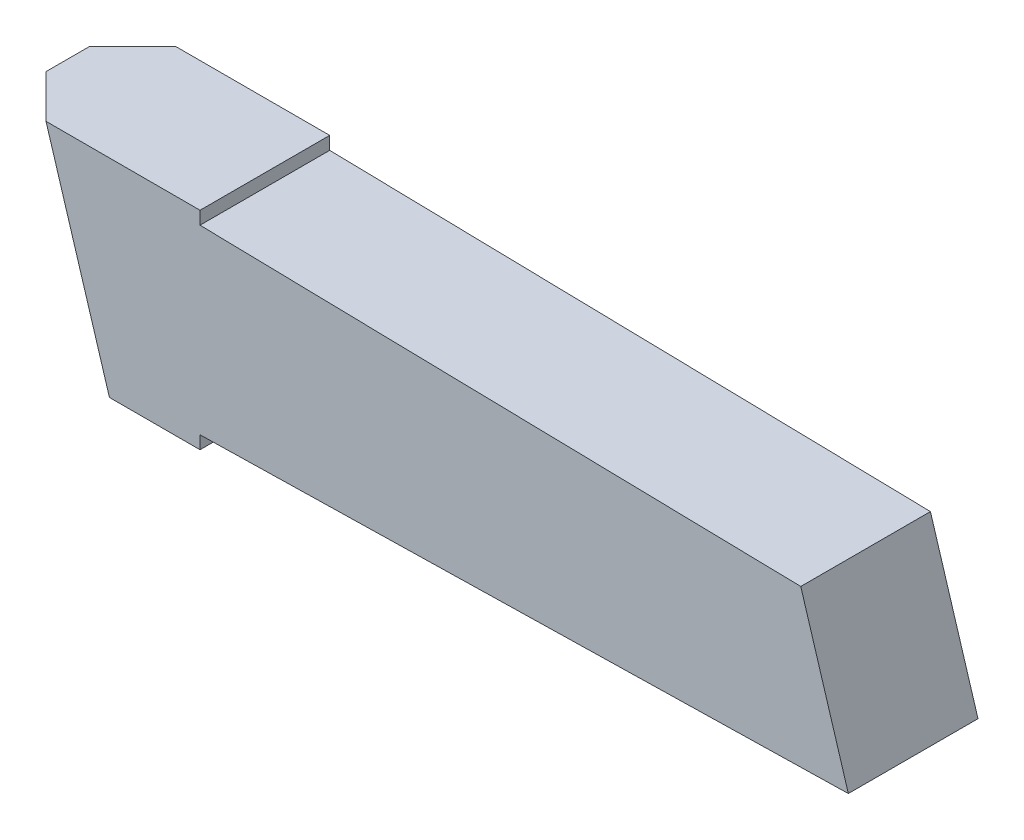
ISO-10303-21;
HEADER;
FILE_DESCRIPTION(('STEP AP214'),'2;1');
FILE_NAME('part.step','',(''),(''),'','','');
FILE_SCHEMA(('AUTOMOTIVE_DESIGN { 1 0 10303 214 1 1 1 1 }'));
ENDSEC;
DATA;
#1=APPLICATION_CONTEXT('core data for automotive mechanical design processes');
#2=APPLICATION_PROTOCOL_DEFINITION('international standard','automotive_design',2000,#1);
#3=PRODUCT_CONTEXT('',#1,'mechanical');
#4=PRODUCT('Part','Part','',(#3));
#5=PRODUCT_RELATED_PRODUCT_CATEGORY('part','',(#4));
#6=PRODUCT_DEFINITION_FORMATION('','',#4);
#7=PRODUCT_DEFINITION_CONTEXT('part definition',#1,'design');
#8=PRODUCT_DEFINITION('design','',#6,#7);
#9=PRODUCT_DEFINITION_SHAPE('','',#8);
#10=(LENGTH_UNIT() NAMED_UNIT(*) SI_UNIT(.MILLI.,.METRE.));
#11=(NAMED_UNIT(*) PLANE_ANGLE_UNIT() SI_UNIT($,.RADIAN.));
#12=(NAMED_UNIT(*) SI_UNIT($,.STERADIAN.) SOLID_ANGLE_UNIT());
#13=UNCERTAINTY_MEASURE_WITH_UNIT(LENGTH_MEASURE(1.E-05),#10,'distance_accuracy_value','');
#14=(GEOMETRIC_REPRESENTATION_CONTEXT(3) GLOBAL_UNCERTAINTY_ASSIGNED_CONTEXT((#13)) GLOBAL_UNIT_ASSIGNED_CONTEXT((#10,
#11,#12)) REPRESENTATION_CONTEXT('',''));
#15=CARTESIAN_POINT('',(0.,0.,0.));
#16=DIRECTION('',(0.,0.,1.));
#17=DIRECTION('',(1.,0.,0.));
#18=AXIS2_PLACEMENT_3D('',#15,#16,#17);
#19=CARTESIAN_POINT('',(0.,-4.,2.5));
#20=DIRECTION('',(0.,1.,0.));
#21=DIRECTION('',(0.,0.,1.));
#22=AXIS2_PLACEMENT_3D('',#19,#20,#21);
#23=PLANE('',#22);
#24=DIRECTION('',(1.,0.,0.));
#25=VECTOR('',#24,1.);
#26=CARTESIAN_POINT('',(0.,-4.,2.5));
#27=LINE('',#26,#25);
#28=CARTESIAN_POINT('',(-3.49415454833078,-4.,2.5));
#29=VERTEX_POINT('',#28);
#30=CARTESIAN_POINT('',(0.,-4.,2.5));
#31=VERTEX_POINT('',#30);
#32=EDGE_CURVE('E165',#29,#31,#27,.T.);
#33=ORIENTED_EDGE('',*,*,#32,.F.);
#34=DIRECTION('',(-0.707106781186547,0.,-0.707106781186548));
#35=VECTOR('',#34,1.);
#36=CARTESIAN_POINT('',(-1.74707727416539,-4.,4.24707727416539));
#37=LINE('',#36,#35);
#38=CARTESIAN_POINT('',(-5.15415454833078,-4.,0.84));
#39=VERTEX_POINT('',#38);
#40=EDGE_CURVE('E50',#29,#39,#37,.T.);
#41=ORIENTED_EDGE('',*,*,#40,.T.);
#42=DIRECTION('',(0.,0.,-1.));
#43=VECTOR('',#42,1.);
#44=CARTESIAN_POINT('',(-5.15415454833078,-4.,2.5));
#45=LINE('',#44,#43);
#46=CARTESIAN_POINT('',(-5.15415454833078,-4.,-0.84));
#47=VERTEX_POINT('',#46);
#48=EDGE_CURVE('E133',#39,#47,#45,.T.);
#49=ORIENTED_EDGE('',*,*,#48,.T.);
#50=DIRECTION('',(0.707106781186547,0.,-0.707106781186548));
#51=VECTOR('',#50,1.);
#52=CARTESIAN_POINT('',(-4.24707727416539,-4.,-1.74707727416539));
#53=LINE('',#52,#51);
#54=CARTESIAN_POINT('',(-3.49415454833078,-4.,-2.5));
#55=VERTEX_POINT('',#54);
#56=EDGE_CURVE('E226',#47,#55,#53,.T.);
#57=ORIENTED_EDGE('',*,*,#56,.T.);
#58=DIRECTION('',(1.,0.,0.));
#59=VECTOR('',#58,1.);
#60=CARTESIAN_POINT('',(0.,-4.,-2.5));
#61=LINE('',#60,#59);
#62=CARTESIAN_POINT('',(0.,-4.,-2.5));
#63=VERTEX_POINT('',#62);
#64=EDGE_CURVE('E144',#55,#63,#61,.T.);
#65=ORIENTED_EDGE('',*,*,#64,.T.);
#66=DIRECTION('',(0.,0.,-1.));
#67=VECTOR('',#66,1.);
#68=CARTESIAN_POINT('',(0.,-4.,2.5));
#69=LINE('',#68,#67);
#70=EDGE_CURVE('E188',#31,#63,#69,.T.);
#71=ORIENTED_EDGE('',*,*,#70,.F.);
#72=EDGE_LOOP('',(#33,#41,#49,#57,#65,#71));
#73=FACE_BOUND('',#72,.T.);
#74=ADVANCED_FACE('F36',(#73),#23,.F.);
#75=CARTESIAN_POINT('',(0.,-3.5,2.5));
#76=DIRECTION('',(-1.,0.,0.));
#77=DIRECTION('',(0.,-1.,0.));
#78=AXIS2_PLACEMENT_3D('',#75,#76,#77);
#79=PLANE('',#78);
#80=DIRECTION('',(0.,1.,0.));
#81=VECTOR('',#80,1.);
#82=CARTESIAN_POINT('',(0.,-3.5,-2.5));
#83=LINE('',#82,#81);
#84=CARTESIAN_POINT('',(0.,-3.5,-2.5));
#85=VERTEX_POINT('',#84);
#86=EDGE_CURVE('E147',#63,#85,#83,.T.);
#87=ORIENTED_EDGE('',*,*,#86,.T.);
#88=DIRECTION('',(0.,0.,-1.));
#89=VECTOR('',#88,1.);
#90=CARTESIAN_POINT('',(0.,-3.5,2.5));
#91=LINE('',#90,#89);
#92=CARTESIAN_POINT('',(0.,-3.5,2.5));
#93=VERTEX_POINT('',#92);
#94=EDGE_CURVE('E184',#93,#85,#91,.T.);
#95=ORIENTED_EDGE('',*,*,#94,.F.);
#96=DIRECTION('',(0.,1.,0.));
#97=VECTOR('',#96,1.);
#98=CARTESIAN_POINT('',(0.,-3.5,2.5));
#99=LINE('',#98,#97);
#100=EDGE_CURVE('E224',#31,#93,#99,.T.);
#101=ORIENTED_EDGE('',*,*,#100,.F.);
#102=ORIENTED_EDGE('',*,*,#70,.T.);
#103=EDGE_LOOP('',(#87,#95,#101,#102));
#104=FACE_BOUND('',#103,.T.);
#105=ADVANCED_FACE('F223',(#104),#79,.F.);
#106=CARTESIAN_POINT('',(0.,-3.5,2.5));
#107=DIRECTION('',(-0.020757225391428,0.999784545586723,0.));
#108=DIRECTION('',(-0.999784545586723,-0.020757225391428,0.));
#109=AXIS2_PLACEMENT_3D('',#106,#107,#108);
#110=PLANE('',#109);
#111=DIRECTION('',(0.999784545586723,0.020757225391428,0.));
#112=VECTOR('',#111,1.);
#113=CARTESIAN_POINT('',(0.,-3.5,-2.5));
#114=LINE('',#113,#112);
#115=CARTESIAN_POINT('',(25.,-2.98095753522459,-2.5));
#116=VERTEX_POINT('',#115);
#117=EDGE_CURVE('E150',#85,#116,#114,.T.);
#118=ORIENTED_EDGE('',*,*,#117,.T.);
#119=DIRECTION('',(0.,0.,-1.));
#120=VECTOR('',#119,1.);
#121=CARTESIAN_POINT('',(25.,-2.98095753522459,2.5));
#122=LINE('',#121,#120);
#123=CARTESIAN_POINT('',(25.,-2.98095753522459,2.5));
#124=VERTEX_POINT('',#123);
#125=EDGE_CURVE('E180',#124,#116,#122,.T.);
#126=ORIENTED_EDGE('',*,*,#125,.F.);
#127=DIRECTION('',(0.999784545586723,0.020757225391428,0.));
#128=VECTOR('',#127,1.);
#129=CARTESIAN_POINT('',(0.,-3.5,2.5));
#130=LINE('',#129,#128);
#131=EDGE_CURVE('E218',#93,#124,#130,.T.);
#132=ORIENTED_EDGE('',*,*,#131,.F.);
#133=ORIENTED_EDGE('',*,*,#94,.T.);
#134=EDGE_LOOP('',(#118,#126,#132,#133));
#135=FACE_BOUND('',#134,.T.);
#136=ADVANCED_FACE('F217',(#135),#110,.F.);
#137=CARTESIAN_POINT('',(23.165615911248,3.01904246477541,2.5));
#138=DIRECTION('',(-0.956304755963031,-0.29237170472275,0.));
#139=DIRECTION('',(0.29237170472275,-0.956304755963031,0.));
#140=AXIS2_PLACEMENT_3D('',#137,#138,#139);
#141=PLANE('',#140);
#142=DIRECTION('',(-0.29237170472275,0.956304755963032,0.));
#143=VECTOR('',#142,1.);
#144=CARTESIAN_POINT('',(23.165615911248,3.01904246477541,-2.5));
#145=LINE('',#144,#143);
#146=CARTESIAN_POINT('',(23.165615911248,3.01904246477541,-2.5));
#147=VERTEX_POINT('',#146);
#148=EDGE_CURVE('E153',#116,#147,#145,.T.);
#149=ORIENTED_EDGE('',*,*,#148,.T.);
#150=DIRECTION('',(0.,0.,-1.));
#151=VECTOR('',#150,1.);
#152=CARTESIAN_POINT('',(23.165615911248,3.01904246477541,2.5));
#153=LINE('',#152,#151);
#154=CARTESIAN_POINT('',(23.165615911248,3.01904246477541,2.5));
#155=VERTEX_POINT('',#154);
#156=EDGE_CURVE('E176',#155,#147,#153,.T.);
#157=ORIENTED_EDGE('',*,*,#156,.F.);
#158=DIRECTION('',(-0.29237170472275,0.956304755963032,0.));
#159=VECTOR('',#158,1.);
#160=CARTESIAN_POINT('',(23.165615911248,3.01904246477541,2.5));
#161=LINE('',#160,#159);
#162=EDGE_CURVE('E213',#124,#155,#161,.T.);
#163=ORIENTED_EDGE('',*,*,#162,.F.);
#164=ORIENTED_EDGE('',*,*,#125,.T.);
#165=EDGE_LOOP('',(#149,#157,#163,#164));
#166=FACE_BOUND('',#165,.T.);
#167=ADVANCED_FACE('F212',(#166),#141,.F.);
#168=CARTESIAN_POINT('',(0.,3.5,2.5));
#169=DIRECTION('',(-0.020757225391428,-0.999784545586723,0.));
#170=DIRECTION('',(0.999784545586723,-0.020757225391428,0.));
#171=AXIS2_PLACEMENT_3D('',#168,#169,#170);
#172=PLANE('',#171);
#173=DIRECTION('',(-0.999784545586723,0.020757225391428,0.));
#174=VECTOR('',#173,1.);
#175=CARTESIAN_POINT('',(0.,3.5,-2.5));
#176=LINE('',#175,#174);
#177=CARTESIAN_POINT('',(0.,3.5,-2.5));
#178=VERTEX_POINT('',#177);
#179=EDGE_CURVE('E156',#147,#178,#176,.T.);
#180=ORIENTED_EDGE('',*,*,#179,.T.);
#181=DIRECTION('',(0.,0.,-1.));
#182=VECTOR('',#181,1.);
#183=CARTESIAN_POINT('',(0.,3.5,2.5));
#184=LINE('',#183,#182);
#185=CARTESIAN_POINT('',(0.,3.5,2.5));
#186=VERTEX_POINT('',#185);
#187=EDGE_CURVE('E172',#186,#178,#184,.T.);
#188=ORIENTED_EDGE('',*,*,#187,.F.);
#189=DIRECTION('',(-0.999784545586723,0.020757225391428,0.));
#190=VECTOR('',#189,1.);
#191=CARTESIAN_POINT('',(0.,3.5,2.5));
#192=LINE('',#191,#190);
#193=EDGE_CURVE('E140',#155,#186,#192,.T.);
#194=ORIENTED_EDGE('',*,*,#193,.F.);
#195=ORIENTED_EDGE('',*,*,#156,.T.);
#196=EDGE_LOOP('',(#180,#188,#194,#195));
#197=FACE_BOUND('',#196,.T.);
#198=ADVANCED_FACE('F207',(#197),#172,.F.);
#199=CARTESIAN_POINT('',(0.,4.,2.5));
#200=DIRECTION('',(-1.,0.,0.));
#201=DIRECTION('',(0.,-1.,0.));
#202=AXIS2_PLACEMENT_3D('',#199,#200,#201);
#203=PLANE('',#202);
#204=DIRECTION('',(0.,1.,0.));
#205=VECTOR('',#204,1.);
#206=CARTESIAN_POINT('',(0.,4.,-2.5));
#207=LINE('',#206,#205);
#208=CARTESIAN_POINT('',(0.,4.,-2.5));
#209=VERTEX_POINT('',#208);
#210=EDGE_CURVE('E159',#178,#209,#207,.T.);
#211=ORIENTED_EDGE('',*,*,#210,.T.);
#212=DIRECTION('',(0.,0.,-1.));
#213=VECTOR('',#212,1.);
#214=CARTESIAN_POINT('',(0.,4.,2.5));
#215=LINE('',#214,#213);
#216=CARTESIAN_POINT('',(0.,4.,2.5));
#217=VERTEX_POINT('',#216);
#218=EDGE_CURVE('E169',#217,#209,#215,.T.);
#219=ORIENTED_EDGE('',*,*,#218,.F.);
#220=DIRECTION('',(0.,1.,0.));
#221=VECTOR('',#220,1.);
#222=CARTESIAN_POINT('',(0.,4.,2.5));
#223=LINE('',#222,#221);
#224=EDGE_CURVE('E130',#186,#217,#223,.T.);
#225=ORIENTED_EDGE('',*,*,#224,.F.);
#226=ORIENTED_EDGE('',*,*,#187,.T.);
#227=EDGE_LOOP('',(#211,#219,#225,#226));
#228=FACE_BOUND('',#227,.T.);
#229=ADVANCED_FACE('F201',(#228),#203,.F.);
#230=CARTESIAN_POINT('',(-7.6,4.,2.5));
#231=DIRECTION('',(0.,-1.,0.));
#232=DIRECTION('',(1.,0.,0.));
#233=AXIS2_PLACEMENT_3D('',#230,#231,#232);
#234=PLANE('',#233);
#235=DIRECTION('',(0.,0.,-1.));
#236=VECTOR('',#235,1.);
#237=CARTESIAN_POINT('',(-7.6,4.,2.5));
#238=LINE('',#237,#236);
#239=CARTESIAN_POINT('',(-7.6,4.,0.84));
#240=VERTEX_POINT('',#239);
#241=CARTESIAN_POINT('',(-7.6,4.,-0.84));
#242=VERTEX_POINT('',#241);
#243=EDGE_CURVE('E123',#240,#242,#238,.T.);
#244=ORIENTED_EDGE('',*,*,#243,.F.);
#245=DIRECTION('',(-0.707106781186547,0.,-0.707106781186548));
#246=VECTOR('',#245,1.);
#247=CARTESIAN_POINT('',(-5.94,4.,2.5));
#248=LINE('',#247,#246);
#249=CARTESIAN_POINT('',(-5.94,4.,2.5));
#250=VERTEX_POINT('',#249);
#251=EDGE_CURVE('E111',#250,#240,#248,.T.);
#252=ORIENTED_EDGE('',*,*,#251,.F.);
#253=DIRECTION('',(-1.,0.,0.));
#254=VECTOR('',#253,1.);
#255=CARTESIAN_POINT('',(-7.6,4.,2.5));
#256=LINE('',#255,#254);
#257=EDGE_CURVE('E121',#217,#250,#256,.T.);
#258=ORIENTED_EDGE('',*,*,#257,.F.);
#259=ORIENTED_EDGE('',*,*,#218,.T.);
#260=DIRECTION('',(-1.,0.,0.));
#261=VECTOR('',#260,1.);
#262=CARTESIAN_POINT('',(-7.6,4.,-2.5));
#263=LINE('',#262,#261);
#264=CARTESIAN_POINT('',(-5.94,4.,-2.5));
#265=VERTEX_POINT('',#264);
#266=EDGE_CURVE('E162',#209,#265,#263,.T.);
#267=ORIENTED_EDGE('',*,*,#266,.T.);
#268=DIRECTION('',(0.707106781186547,0.,-0.707106781186548));
#269=VECTOR('',#268,1.);
#270=CARTESIAN_POINT('',(-5.94,4.,-2.5));
#271=LINE('',#270,#269);
#272=EDGE_CURVE('E58',#242,#265,#271,.T.);
#273=ORIENTED_EDGE('',*,*,#272,.F.);
#274=EDGE_LOOP('',(#244,#252,#258,#259,#267,#273));
#275=FACE_BOUND('',#274,.T.);
#276=ADVANCED_FACE('F119',(#275),#234,.F.);
#277=CARTESIAN_POINT('',(-5.15415454833078,-4.,2.5));
#278=DIRECTION('',(0.956304755963038,0.29237170472273,0.));
#279=DIRECTION('',(-0.29237170472273,0.956304755963038,0.));
#280=AXIS2_PLACEMENT_3D('',#277,#278,#279);
#281=PLANE('',#280);
#282=ORIENTED_EDGE('',*,*,#48,.F.);
#283=DIRECTION('',(-0.29237170472273,0.956304755963038,0.));
#284=VECTOR('',#283,1.);
#285=CARTESIAN_POINT('',(-4.6762829527727,-5.56304755963038,0.84));
#286=LINE('',#285,#284);
#287=EDGE_CURVE('E125',#39,#240,#286,.T.);
#288=ORIENTED_EDGE('',*,*,#287,.T.);
#289=ORIENTED_EDGE('',*,*,#243,.T.);
#290=DIRECTION('',(-0.29237170472273,0.956304755963038,0.));
#291=VECTOR('',#290,1.);
#292=CARTESIAN_POINT('',(-4.6762829527727,-5.56304755963038,-0.84));
#293=LINE('',#292,#291);
#294=EDGE_CURVE('E126',#47,#242,#293,.T.);
#295=ORIENTED_EDGE('',*,*,#294,.F.);
#296=EDGE_LOOP('',(#282,#288,#289,#295));
#297=FACE_BOUND('',#296,.T.);
#298=ADVANCED_FACE('F269',(#297),#281,.F.);
#299=CARTESIAN_POINT('',(0.,-4.,2.5));
#300=DIRECTION('',(0.,0.,1.));
#301=DIRECTION('',(1.,0.,0.));
#302=AXIS2_PLACEMENT_3D('',#299,#300,#301);
#303=PLANE('',#302);
#304=DIRECTION('',(-0.29237170472273,0.956304755963037,0.));
#305=VECTOR('',#304,1.);
#306=CARTESIAN_POINT('',(-3.19546997660555,-4.97695321352829,2.5));
#307=LINE('',#306,#305);
#308=EDGE_CURVE('E11',#29,#250,#307,.T.);
#309=ORIENTED_EDGE('',*,*,#308,.F.);
#310=ORIENTED_EDGE('',*,*,#32,.T.);
#311=ORIENTED_EDGE('',*,*,#100,.T.);
#312=ORIENTED_EDGE('',*,*,#131,.T.);
#313=ORIENTED_EDGE('',*,*,#162,.T.);
#314=ORIENTED_EDGE('',*,*,#193,.T.);
#315=ORIENTED_EDGE('',*,*,#224,.T.);
#316=ORIENTED_EDGE('',*,*,#257,.T.);
#317=EDGE_LOOP('',(#309,#310,#311,#312,#313,#314,#315,#316));
#318=FACE_BOUND('',#317,.T.);
#319=ADVANCED_FACE('F128',(#318),#303,.T.);
#320=CARTESIAN_POINT('',(0.,-4.,-2.5));
#321=DIRECTION('',(0.,0.,1.));
#322=DIRECTION('',(1.,0.,0.));
#323=AXIS2_PLACEMENT_3D('',#320,#321,#322);
#324=PLANE('',#323);
#325=ORIENTED_EDGE('',*,*,#64,.F.);
#326=DIRECTION('',(-0.29237170472273,0.956304755963037,0.));
#327=VECTOR('',#326,1.);
#328=CARTESIAN_POINT('',(-3.19546997660555,-4.97695321352829,-2.5));
#329=LINE('',#328,#327);
#330=EDGE_CURVE('E44',#55,#265,#329,.T.);
#331=ORIENTED_EDGE('',*,*,#330,.T.);
#332=ORIENTED_EDGE('',*,*,#266,.F.);
#333=ORIENTED_EDGE('',*,*,#210,.F.);
#334=ORIENTED_EDGE('',*,*,#179,.F.);
#335=ORIENTED_EDGE('',*,*,#148,.F.);
#336=ORIENTED_EDGE('',*,*,#117,.F.);
#337=ORIENTED_EDGE('',*,*,#86,.F.);
#338=EDGE_LOOP('',(#325,#331,#332,#333,#334,#335,#336,#337));
#339=FACE_BOUND('',#338,.T.);
#340=ADVANCED_FACE('F196',(#339),#324,.F.);
#341=CARTESIAN_POINT('',(-3.0162829527727,-5.56304755963038,-2.5));
#342=DIRECTION('',(0.691140749344681,0.211302932280994,0.691140749344681));
#343=DIRECTION('',(0.707106781186547,0.,-0.707106781186548));
#344=AXIS2_PLACEMENT_3D('',#341,#342,#343);
#345=PLANE('',#344);
#346=ORIENTED_EDGE('',*,*,#294,.T.);
#347=ORIENTED_EDGE('',*,*,#272,.T.);
#348=ORIENTED_EDGE('',*,*,#330,.F.);
#349=ORIENTED_EDGE('',*,*,#56,.F.);
#350=EDGE_LOOP('',(#346,#347,#348,#349));
#351=FACE_BOUND('',#350,.T.);
#352=ADVANCED_FACE('F267',(#351),#345,.F.);
#353=CARTESIAN_POINT('',(-3.0162829527727,-5.56304755963038,2.5));
#354=DIRECTION('',(0.691140749344681,0.211302932280994,-0.691140749344681));
#355=DIRECTION('',(-0.707106781186547,0.,-0.707106781186548));
#356=AXIS2_PLACEMENT_3D('',#353,#354,#355);
#357=PLANE('',#356);
#358=ORIENTED_EDGE('',*,*,#308,.T.);
#359=ORIENTED_EDGE('',*,*,#251,.T.);
#360=ORIENTED_EDGE('',*,*,#287,.F.);
#361=ORIENTED_EDGE('',*,*,#40,.F.);
#362=EDGE_LOOP('',(#358,#359,#360,#361));
#363=FACE_BOUND('',#362,.T.);
#364=ADVANCED_FACE('F110',(#363),#357,.F.);
#365=CLOSED_SHELL('',(#74,#105,#136,#167,#198,#229,#276,#298,#319,#340,#352,#364));
#366=MANIFOLD_SOLID_BREP('B2',#365);
#367=ADVANCED_BREP_SHAPE_REPRESENTATION('',(#18,#366),#14);
#368=SHAPE_DEFINITION_REPRESENTATION(#9,#367);
ENDSEC;
END-ISO-10303-21;
